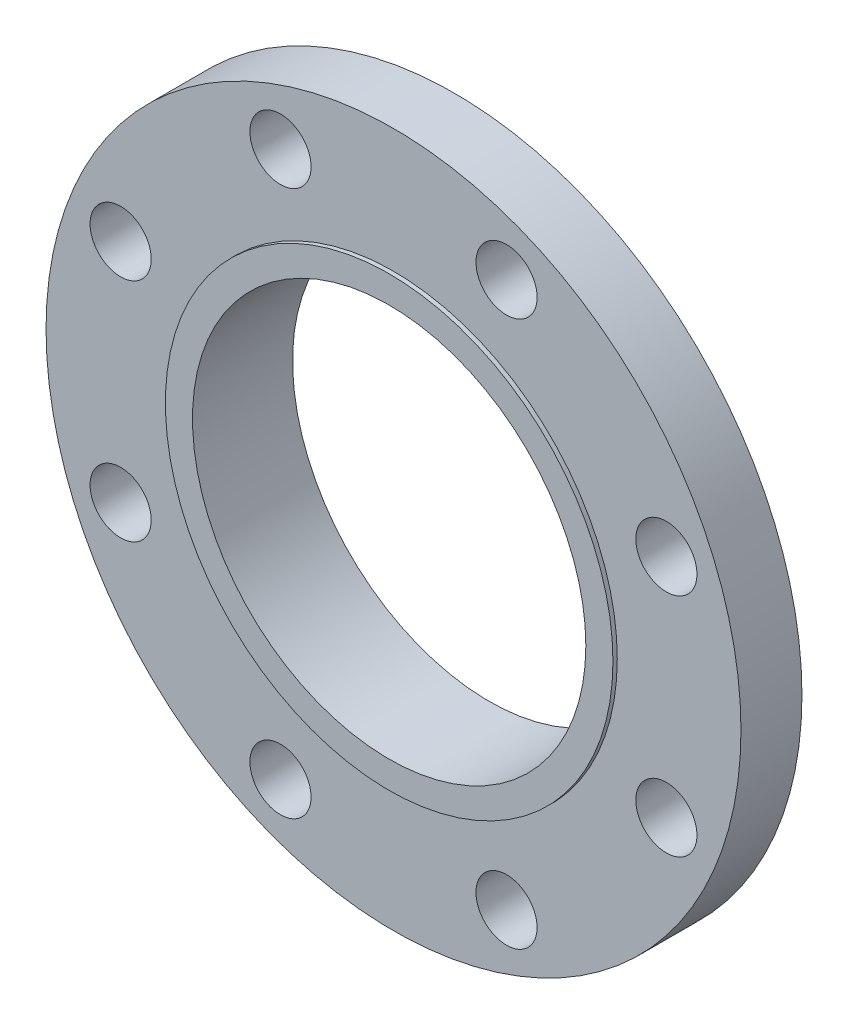
ISO-10303-21;
HEADER;
FILE_DESCRIPTION(('STEP AP214'),'2;1');
FILE_NAME('part.step','',(''),(''),'','','');
FILE_SCHEMA(('AUTOMOTIVE_DESIGN { 1 0 10303 214 1 1 1 1 }'));
ENDSEC;
DATA;
#1=APPLICATION_CONTEXT('core data for automotive mechanical design processes');
#2=APPLICATION_PROTOCOL_DEFINITION('international standard','automotive_design',2000,#1);
#3=PRODUCT_CONTEXT('',#1,'mechanical');
#4=PRODUCT('Part','Part','',(#3));
#5=PRODUCT_RELATED_PRODUCT_CATEGORY('part','',(#4));
#6=PRODUCT_DEFINITION_FORMATION('','',#4);
#7=PRODUCT_DEFINITION_CONTEXT('part definition',#1,'design');
#8=PRODUCT_DEFINITION('design','',#6,#7);
#9=PRODUCT_DEFINITION_SHAPE('','',#8);
#10=(LENGTH_UNIT() NAMED_UNIT(*) SI_UNIT(.MILLI.,.METRE.));
#11=(NAMED_UNIT(*) PLANE_ANGLE_UNIT() SI_UNIT($,.RADIAN.));
#12=(NAMED_UNIT(*) SI_UNIT($,.STERADIAN.) SOLID_ANGLE_UNIT());
#13=UNCERTAINTY_MEASURE_WITH_UNIT(LENGTH_MEASURE(1.E-05),#10,'distance_accuracy_value','');
#14=(GEOMETRIC_REPRESENTATION_CONTEXT(3) GLOBAL_UNCERTAINTY_ASSIGNED_CONTEXT((#13)) GLOBAL_UNIT_ASSIGNED_CONTEXT((#10,
#11,#12)) REPRESENTATION_CONTEXT('',''));
#15=CARTESIAN_POINT('',(0.,0.,0.));
#16=DIRECTION('',(0.,0.,1.));
#17=DIRECTION('',(1.,0.,0.));
#18=AXIS2_PLACEMENT_3D('',#15,#16,#17);
#19=CARTESIAN_POINT('',(0.,0.,-36.576));
#20=DIRECTION('',(0.,0.,1.));
#21=DIRECTION('',(1.,0.,0.));
#22=AXIS2_PLACEMENT_3D('',#19,#20,#21);
#23=CYLINDRICAL_SURFACE('',#22,81.788);
#24=CARTESIAN_POINT('',(0.,0.,-1.5875));
#25=DIRECTION('',(0.,0.,1.));
#26=DIRECTION('',(1.,0.,0.));
#27=AXIS2_PLACEMENT_3D('',#24,#25,#26);
#28=CIRCLE('',#27,81.788);
#29=CARTESIAN_POINT('',(81.788,0.,-1.5875));
#30=VERTEX_POINT('',#29);
#31=EDGE_CURVE('E10',#30,#30,#28,.F.);
#32=ORIENTED_EDGE('',*,*,#31,.F.);
#33=EDGE_LOOP('',(#32));
#34=FACE_BOUND('',#33,.T.);
#35=CARTESIAN_POINT('',(0.,0.,0.));
#36=DIRECTION('',(0.,0.,1.));
#37=DIRECTION('',(1.,0.,0.));
#38=AXIS2_PLACEMENT_3D('',#35,#36,#37);
#39=CIRCLE('',#38,81.788);
#40=CARTESIAN_POINT('',(81.788,0.,0.));
#41=VERTEX_POINT('',#40);
#42=EDGE_CURVE('E49',#41,#41,#39,.T.);
#43=ORIENTED_EDGE('',*,*,#42,.F.);
#44=EDGE_LOOP('',(#43));
#45=FACE_BOUND('',#44,.T.);
#46=ADVANCED_FACE('F37',(#34,#45),#23,.T.);
#47=CARTESIAN_POINT('',(0.,0.,0.));
#48=DIRECTION('',(0.,0.,1.));
#49=DIRECTION('',(1.,0.,0.));
#50=AXIS2_PLACEMENT_3D('',#47,#48,#49);
#51=PLANE('',#50);
#52=CARTESIAN_POINT('',(0.,0.,0.));
#53=DIRECTION('',(0.,0.,1.));
#54=DIRECTION('',(1.,0.,0.));
#55=AXIS2_PLACEMENT_3D('',#52,#53,#54);
#56=CIRCLE('',#55,71.882);
#57=CARTESIAN_POINT('',(71.882,0.,0.));
#58=VERTEX_POINT('',#57);
#59=EDGE_CURVE('E57',#58,#58,#56,.T.);
#60=ORIENTED_EDGE('',*,*,#59,.F.);
#61=EDGE_LOOP('',(#60));
#62=FACE_BOUND('',#61,.T.);
#63=ORIENTED_EDGE('',*,*,#42,.T.);
#64=EDGE_LOOP('',(#63));
#65=FACE_BOUND('',#64,.T.);
#66=ADVANCED_FACE('F93',(#62,#65),#51,.T.);
#67=CARTESIAN_POINT('',(0.,0.,-383.086244842766));
#68=DIRECTION('',(0.,0.,1.));
#69=DIRECTION('',(1.,0.,0.));
#70=AXIS2_PLACEMENT_3D('',#67,#68,#69);
#71=CYLINDRICAL_SURFACE('',#70,127.);
#72=CARTESIAN_POINT('',(0.,0.,-23.876));
#73=DIRECTION('',(0.,0.,1.));
#74=DIRECTION('',(1.,0.,0.));
#75=AXIS2_PLACEMENT_3D('',#72,#73,#74);
#76=CIRCLE('',#75,127.);
#77=CARTESIAN_POINT('',(127.,0.,-23.876));
#78=VERTEX_POINT('',#77);
#79=EDGE_CURVE('E61',#78,#78,#76,.F.);
#80=ORIENTED_EDGE('',*,*,#79,.F.);
#81=EDGE_LOOP('',(#80));
#82=FACE_BOUND('',#81,.T.);
#83=CARTESIAN_POINT('',(0.,0.,-1.5875));
#84=DIRECTION('',(0.,0.,1.));
#85=DIRECTION('',(1.,0.,0.));
#86=AXIS2_PLACEMENT_3D('',#83,#84,#85);
#87=CIRCLE('',#86,127.);
#88=CARTESIAN_POINT('',(127.,0.,-1.5875));
#89=VERTEX_POINT('',#88);
#90=EDGE_CURVE('E56',#89,#89,#87,.T.);
#91=ORIENTED_EDGE('',*,*,#90,.F.);
#92=EDGE_LOOP('',(#91));
#93=FACE_BOUND('',#92,.T.);
#94=ADVANCED_FACE('F90',(#82,#93),#71,.T.);
#95=CARTESIAN_POINT('',(0.,0.,-1.5875));
#96=DIRECTION('',(0.,0.,1.));
#97=DIRECTION('',(1.,0.,0.));
#98=AXIS2_PLACEMENT_3D('',#95,#96,#97);
#99=PLANE('',#98);
#100=CARTESIAN_POINT('',(99.7327955345929,41.3106765238126,-1.5875));
#101=DIRECTION('',(0.,0.,1.));
#102=DIRECTION('',(0.707106781186556,-0.707106781186539,0.));
#103=AXIS2_PLACEMENT_3D('',#100,#101,#102);
#104=CIRCLE('',#103,11.176);
#105=CARTESIAN_POINT('',(107.635420921134,33.4080511372718,-1.5875));
#106=VERTEX_POINT('',#105);
#107=EDGE_CURVE('E217',#106,#106,#104,.T.);
#108=ORIENTED_EDGE('',*,*,#107,.F.);
#109=EDGE_LOOP('',(#108));
#110=FACE_BOUND('',#109,.T.);
#111=CARTESIAN_POINT('',(99.7327955345938,-41.3106765238105,-1.5875));
#112=DIRECTION('',(0.,0.,1.));
#113=DIRECTION('',(0.,-1.,0.));
#114=AXIS2_PLACEMENT_3D('',#111,#112,#113);
#115=CIRCLE('',#114,11.176);
#116=CARTESIAN_POINT('',(99.7327955345939,-52.4866765238105,-1.5875));
#117=VERTEX_POINT('',#116);
#118=EDGE_CURVE('E221',#117,#117,#115,.T.);
#119=ORIENTED_EDGE('',*,*,#118,.F.);
#120=EDGE_LOOP('',(#119));
#121=FACE_BOUND('',#120,.T.);
#122=CARTESIAN_POINT('',(41.3106765238122,-99.7327955345931,-1.5875));
#123=DIRECTION('',(0.,0.,1.));
#124=DIRECTION('',(-0.707106781186541,-0.707106781186554,0.));
#125=AXIS2_PLACEMENT_3D('',#122,#123,#124);
#126=CIRCLE('',#125,11.176);
#127=CARTESIAN_POINT('',(33.4080511372714,-107.635420921134,-1.5875));
#128=VERTEX_POINT('',#127);
#129=EDGE_CURVE('E230',#128,#128,#126,.T.);
#130=ORIENTED_EDGE('',*,*,#129,.F.);
#131=EDGE_LOOP('',(#130));
#132=FACE_BOUND('',#131,.T.);
#133=CARTESIAN_POINT('',(-41.3106765238108,-99.7327955345937,-1.5875));
#134=DIRECTION('',(0.,0.,1.));
#135=DIRECTION('',(-1.,0.,0.));
#136=AXIS2_PLACEMENT_3D('',#133,#134,#135);
#137=CIRCLE('',#136,11.176);
#138=CARTESIAN_POINT('',(-52.4866765238108,-99.7327955345937,-1.5875));
#139=VERTEX_POINT('',#138);
#140=EDGE_CURVE('E236',#139,#139,#137,.T.);
#141=ORIENTED_EDGE('',*,*,#140,.F.);
#142=EDGE_LOOP('',(#141));
#143=FACE_BOUND('',#142,.T.);
#144=CARTESIAN_POINT('',(-99.7327955345932,-41.3106765238119,-1.5875));
#145=DIRECTION('',(0.,0.,1.));
#146=DIRECTION('',(-0.707106781186551,0.707106781186544,0.));
#147=AXIS2_PLACEMENT_3D('',#144,#145,#146);
#148=CIRCLE('',#147,11.176);
#149=CARTESIAN_POINT('',(-107.635420921134,-33.4080511372711,-1.5875));
#150=VERTEX_POINT('',#149);
#151=EDGE_CURVE('E242',#150,#150,#148,.T.);
#152=ORIENTED_EDGE('',*,*,#151,.F.);
#153=EDGE_LOOP('',(#152));
#154=FACE_BOUND('',#153,.T.);
#155=CARTESIAN_POINT('',(-99.7327955345935,41.3106765238112,-1.5875));
#156=DIRECTION('',(0.,0.,1.));
#157=DIRECTION('',(0.,1.,0.));
#158=AXIS2_PLACEMENT_3D('',#155,#156,#157);
#159=CIRCLE('',#158,11.176);
#160=CARTESIAN_POINT('',(-99.7327955345935,52.4866765238112,-1.5875));
#161=VERTEX_POINT('',#160);
#162=EDGE_CURVE('E248',#161,#161,#159,.T.);
#163=ORIENTED_EDGE('',*,*,#162,.F.);
#164=EDGE_LOOP('',(#163));
#165=FACE_BOUND('',#164,.T.);
#166=CARTESIAN_POINT('',(-41.3106765238115,99.7327955345934,-1.5875));
#167=DIRECTION('',(0.,0.,1.));
#168=DIRECTION('',(0.707106781186546,0.707106781186549,0.));
#169=AXIS2_PLACEMENT_3D('',#166,#167,#168);
#170=CIRCLE('',#169,11.176);
#171=CARTESIAN_POINT('',(-33.4080511372707,107.635420921134,-1.5875));
#172=VERTEX_POINT('',#171);
#173=EDGE_CURVE('E254',#172,#172,#170,.T.);
#174=ORIENTED_EDGE('',*,*,#173,.F.);
#175=EDGE_LOOP('',(#174));
#176=FACE_BOUND('',#175,.T.);
#177=CARTESIAN_POINT('',(41.3106765238115,99.7327955345934,-1.5875));
#178=DIRECTION('',(0.,0.,1.));
#179=DIRECTION('',(1.,0.,0.));
#180=AXIS2_PLACEMENT_3D('',#177,#178,#179);
#181=CIRCLE('',#180,11.176);
#182=CARTESIAN_POINT('',(52.4866765238115,99.7327955345934,-1.5875));
#183=VERTEX_POINT('',#182);
#184=EDGE_CURVE('E68',#183,#183,#181,.T.);
#185=ORIENTED_EDGE('',*,*,#184,.F.);
#186=EDGE_LOOP('',(#185));
#187=FACE_BOUND('',#186,.T.);
#188=ORIENTED_EDGE('',*,*,#31,.T.);
#189=EDGE_LOOP('',(#188));
#190=FACE_BOUND('',#189,.T.);
#191=ORIENTED_EDGE('',*,*,#90,.T.);
#192=EDGE_LOOP('',(#191));
#193=FACE_BOUND('',#192,.T.);
#194=ADVANCED_FACE('F85',(#110,#121,#132,#143,#154,#165,#176,#187,#190,#193),#99,.T.);
#195=CARTESIAN_POINT('',(0.,0.,-23.876));
#196=DIRECTION('',(0.,0.,1.));
#197=DIRECTION('',(1.,0.,0.));
#198=AXIS2_PLACEMENT_3D('',#195,#196,#197);
#199=PLANE('',#198);
#200=CARTESIAN_POINT('',(99.7327955345929,41.3106765238126,-23.876));
#201=DIRECTION('',(0.,0.,1.));
#202=DIRECTION('',(0.707106781186556,-0.707106781186539,0.));
#203=AXIS2_PLACEMENT_3D('',#200,#201,#202);
#204=CIRCLE('',#203,11.176);
#205=CARTESIAN_POINT('',(107.635420921134,33.4080511372718,-23.876));
#206=VERTEX_POINT('',#205);
#207=EDGE_CURVE('E220',#206,#206,#204,.T.);
#208=ORIENTED_EDGE('',*,*,#207,.T.);
#209=EDGE_LOOP('',(#208));
#210=FACE_BOUND('',#209,.T.);
#211=CARTESIAN_POINT('',(99.7327955345938,-41.3106765238105,-23.876));
#212=DIRECTION('',(0.,0.,1.));
#213=DIRECTION('',(0.,-1.,0.));
#214=AXIS2_PLACEMENT_3D('',#211,#212,#213);
#215=CIRCLE('',#214,11.176);
#216=CARTESIAN_POINT('',(99.7327955345939,-52.4866765238105,-23.876));
#217=VERTEX_POINT('',#216);
#218=EDGE_CURVE('E224',#217,#217,#215,.T.);
#219=ORIENTED_EDGE('',*,*,#218,.T.);
#220=EDGE_LOOP('',(#219));
#221=FACE_BOUND('',#220,.T.);
#222=CARTESIAN_POINT('',(41.3106765238122,-99.7327955345931,-23.876));
#223=DIRECTION('',(0.,0.,1.));
#224=DIRECTION('',(-0.707106781186541,-0.707106781186554,0.));
#225=AXIS2_PLACEMENT_3D('',#222,#223,#224);
#226=CIRCLE('',#225,11.176);
#227=CARTESIAN_POINT('',(33.4080511372714,-107.635420921134,-23.876));
#228=VERTEX_POINT('',#227);
#229=EDGE_CURVE('E233',#228,#228,#226,.T.);
#230=ORIENTED_EDGE('',*,*,#229,.T.);
#231=EDGE_LOOP('',(#230));
#232=FACE_BOUND('',#231,.T.);
#233=CARTESIAN_POINT('',(-41.3106765238108,-99.7327955345937,-23.876));
#234=DIRECTION('',(0.,0.,1.));
#235=DIRECTION('',(-1.,0.,0.));
#236=AXIS2_PLACEMENT_3D('',#233,#234,#235);
#237=CIRCLE('',#236,11.176);
#238=CARTESIAN_POINT('',(-52.4866765238108,-99.7327955345937,-23.876));
#239=VERTEX_POINT('',#238);
#240=EDGE_CURVE('E239',#239,#239,#237,.T.);
#241=ORIENTED_EDGE('',*,*,#240,.T.);
#242=EDGE_LOOP('',(#241));
#243=FACE_BOUND('',#242,.T.);
#244=CARTESIAN_POINT('',(-99.7327955345932,-41.3106765238119,-23.876));
#245=DIRECTION('',(0.,0.,1.));
#246=DIRECTION('',(-0.707106781186551,0.707106781186544,0.));
#247=AXIS2_PLACEMENT_3D('',#244,#245,#246);
#248=CIRCLE('',#247,11.176);
#249=CARTESIAN_POINT('',(-107.635420921134,-33.4080511372711,-23.876));
#250=VERTEX_POINT('',#249);
#251=EDGE_CURVE('E245',#250,#250,#248,.T.);
#252=ORIENTED_EDGE('',*,*,#251,.T.);
#253=EDGE_LOOP('',(#252));
#254=FACE_BOUND('',#253,.T.);
#255=CARTESIAN_POINT('',(-99.7327955345935,41.3106765238112,-23.876));
#256=DIRECTION('',(0.,0.,1.));
#257=DIRECTION('',(0.,1.,0.));
#258=AXIS2_PLACEMENT_3D('',#255,#256,#257);
#259=CIRCLE('',#258,11.176);
#260=CARTESIAN_POINT('',(-99.7327955345935,52.4866765238112,-23.876));
#261=VERTEX_POINT('',#260);
#262=EDGE_CURVE('E251',#261,#261,#259,.T.);
#263=ORIENTED_EDGE('',*,*,#262,.T.);
#264=EDGE_LOOP('',(#263));
#265=FACE_BOUND('',#264,.T.);
#266=CARTESIAN_POINT('',(-41.3106765238115,99.7327955345934,-23.876));
#267=DIRECTION('',(0.,0.,1.));
#268=DIRECTION('',(0.707106781186546,0.707106781186549,0.));
#269=AXIS2_PLACEMENT_3D('',#266,#267,#268);
#270=CIRCLE('',#269,11.176);
#271=CARTESIAN_POINT('',(-33.4080511372707,107.635420921134,-23.876));
#272=VERTEX_POINT('',#271);
#273=EDGE_CURVE('E256',#272,#272,#270,.T.);
#274=ORIENTED_EDGE('',*,*,#273,.T.);
#275=EDGE_LOOP('',(#274));
#276=FACE_BOUND('',#275,.T.);
#277=CARTESIAN_POINT('',(41.3106765238115,99.7327955345934,-23.876));
#278=DIRECTION('',(0.,0.,1.));
#279=DIRECTION('',(1.,0.,0.));
#280=AXIS2_PLACEMENT_3D('',#277,#278,#279);
#281=CIRCLE('',#280,11.176);
#282=CARTESIAN_POINT('',(52.4866765238115,99.7327955345934,-23.876));
#283=VERTEX_POINT('',#282);
#284=EDGE_CURVE('E40',#283,#283,#281,.T.);
#285=ORIENTED_EDGE('',*,*,#284,.T.);
#286=EDGE_LOOP('',(#285));
#287=FACE_BOUND('',#286,.T.);
#288=CARTESIAN_POINT('',(0.,0.,-23.876));
#289=DIRECTION('',(0.,0.,1.));
#290=DIRECTION('',(1.,0.,0.));
#291=AXIS2_PLACEMENT_3D('',#288,#289,#290);
#292=CIRCLE('',#291,81.788);
#293=CARTESIAN_POINT('',(81.788,0.,-23.876));
#294=VERTEX_POINT('',#293);
#295=EDGE_CURVE('E52',#294,#294,#292,.F.);
#296=ORIENTED_EDGE('',*,*,#295,.F.);
#297=EDGE_LOOP('',(#296));
#298=FACE_BOUND('',#297,.T.);
#299=ORIENTED_EDGE('',*,*,#79,.T.);
#300=EDGE_LOOP('',(#299));
#301=FACE_BOUND('',#300,.T.);
#302=ADVANCED_FACE('F81',(#210,#221,#232,#243,#254,#265,#276,#287,#298,#301),#199,.F.);
#303=CARTESIAN_POINT('',(0.,0.,-36.576));
#304=DIRECTION('',(0.,0.,1.));
#305=DIRECTION('',(1.,0.,0.));
#306=AXIS2_PLACEMENT_3D('',#303,#304,#305);
#307=PLANE('',#306);
#308=CARTESIAN_POINT('',(0.,0.,-36.576));
#309=DIRECTION('',(0.,0.,1.));
#310=DIRECTION('',(1.,0.,0.));
#311=AXIS2_PLACEMENT_3D('',#308,#309,#310);
#312=CIRCLE('',#311,71.882);
#313=CARTESIAN_POINT('',(71.882,0.,-36.576));
#314=VERTEX_POINT('',#313);
#315=EDGE_CURVE('E54',#314,#314,#312,.T.);
#316=ORIENTED_EDGE('',*,*,#315,.T.);
#317=EDGE_LOOP('',(#316));
#318=FACE_BOUND('',#317,.T.);
#319=CARTESIAN_POINT('',(0.,0.,-36.576));
#320=DIRECTION('',(0.,0.,1.));
#321=DIRECTION('',(1.,0.,0.));
#322=AXIS2_PLACEMENT_3D('',#319,#320,#321);
#323=CIRCLE('',#322,81.788);
#324=CARTESIAN_POINT('',(81.788,0.,-36.576));
#325=VERTEX_POINT('',#324);
#326=EDGE_CURVE('E44',#325,#325,#323,.T.);
#327=ORIENTED_EDGE('',*,*,#326,.F.);
#328=EDGE_LOOP('',(#327));
#329=FACE_BOUND('',#328,.T.);
#330=ADVANCED_FACE('F84',(#318,#329),#307,.F.);
#331=ORIENTED_EDGE('',*,*,#326,.T.);
#332=EDGE_LOOP('',(#331));
#333=FACE_BOUND('',#332,.T.);
#334=ORIENTED_EDGE('',*,*,#295,.T.);
#335=EDGE_LOOP('',(#334));
#336=FACE_BOUND('',#335,.T.);
#337=ADVANCED_FACE('F79',(#333,#336),#23,.T.);
#338=CARTESIAN_POINT('',(0.,0.,19.5213114803758));
#339=DIRECTION('',(0.,0.,1.));
#340=DIRECTION('',(1.,0.,0.));
#341=AXIS2_PLACEMENT_3D('',#338,#339,#340);
#342=CYLINDRICAL_SURFACE('',#341,71.882);
#343=ORIENTED_EDGE('',*,*,#59,.T.);
#344=EDGE_LOOP('',(#343));
#345=FACE_BOUND('',#344,.T.);
#346=ORIENTED_EDGE('',*,*,#315,.F.);
#347=EDGE_LOOP('',(#346));
#348=FACE_BOUND('',#347,.T.);
#349=ADVANCED_FACE('F113',(#345,#348),#342,.F.);
#350=CARTESIAN_POINT('',(41.3106765238115,99.7327955345934,-36.576));
#351=DIRECTION('',(0.,0.,1.));
#352=DIRECTION('',(1.,0.,0.));
#353=AXIS2_PLACEMENT_3D('',#350,#351,#352);
#354=CYLINDRICAL_SURFACE('',#353,11.176);
#355=ORIENTED_EDGE('',*,*,#184,.T.);
#356=EDGE_LOOP('',(#355));
#357=FACE_BOUND('',#356,.T.);
#358=ORIENTED_EDGE('',*,*,#284,.F.);
#359=EDGE_LOOP('',(#358));
#360=FACE_BOUND('',#359,.T.);
#361=ADVANCED_FACE('F118',(#357,#360),#354,.F.);
#362=CARTESIAN_POINT('',(-41.3106765238115,99.7327955345934,-36.576));
#363=DIRECTION('',(0.,0.,1.));
#364=DIRECTION('',(0.707106781186546,0.707106781186549,0.));
#365=AXIS2_PLACEMENT_3D('',#362,#363,#364);
#366=CYLINDRICAL_SURFACE('',#365,11.176);
#367=ORIENTED_EDGE('',*,*,#173,.T.);
#368=EDGE_LOOP('',(#367));
#369=FACE_BOUND('',#368,.T.);
#370=ORIENTED_EDGE('',*,*,#273,.F.);
#371=EDGE_LOOP('',(#370));
#372=FACE_BOUND('',#371,.T.);
#373=ADVANCED_FACE('F139',(#369,#372),#366,.F.);
#374=CARTESIAN_POINT('',(-99.7327955345935,41.3106765238112,-36.576));
#375=DIRECTION('',(0.,0.,1.));
#376=DIRECTION('',(0.,1.,0.));
#377=AXIS2_PLACEMENT_3D('',#374,#375,#376);
#378=CYLINDRICAL_SURFACE('',#377,11.176);
#379=ORIENTED_EDGE('',*,*,#162,.T.);
#380=EDGE_LOOP('',(#379));
#381=FACE_BOUND('',#380,.T.);
#382=ORIENTED_EDGE('',*,*,#262,.F.);
#383=EDGE_LOOP('',(#382));
#384=FACE_BOUND('',#383,.T.);
#385=ADVANCED_FACE('F152',(#381,#384),#378,.F.);
#386=CARTESIAN_POINT('',(-99.7327955345932,-41.3106765238119,-36.576));
#387=DIRECTION('',(0.,0.,1.));
#388=DIRECTION('',(-0.707106781186551,0.707106781186544,0.));
#389=AXIS2_PLACEMENT_3D('',#386,#387,#388);
#390=CYLINDRICAL_SURFACE('',#389,11.176);
#391=ORIENTED_EDGE('',*,*,#151,.T.);
#392=EDGE_LOOP('',(#391));
#393=FACE_BOUND('',#392,.T.);
#394=ORIENTED_EDGE('',*,*,#251,.F.);
#395=EDGE_LOOP('',(#394));
#396=FACE_BOUND('',#395,.T.);
#397=ADVANCED_FACE('F162',(#393,#396),#390,.F.);
#398=CARTESIAN_POINT('',(-41.3106765238108,-99.7327955345937,-36.576));
#399=DIRECTION('',(0.,0.,1.));
#400=DIRECTION('',(-1.,0.,0.));
#401=AXIS2_PLACEMENT_3D('',#398,#399,#400);
#402=CYLINDRICAL_SURFACE('',#401,11.176);
#403=ORIENTED_EDGE('',*,*,#140,.T.);
#404=EDGE_LOOP('',(#403));
#405=FACE_BOUND('',#404,.T.);
#406=ORIENTED_EDGE('',*,*,#240,.F.);
#407=EDGE_LOOP('',(#406));
#408=FACE_BOUND('',#407,.T.);
#409=ADVANCED_FACE('F172',(#405,#408),#402,.F.);
#410=CARTESIAN_POINT('',(41.3106765238122,-99.7327955345931,-36.576));
#411=DIRECTION('',(0.,0.,1.));
#412=DIRECTION('',(-0.707106781186541,-0.707106781186554,0.));
#413=AXIS2_PLACEMENT_3D('',#410,#411,#412);
#414=CYLINDRICAL_SURFACE('',#413,11.176);
#415=ORIENTED_EDGE('',*,*,#129,.T.);
#416=EDGE_LOOP('',(#415));
#417=FACE_BOUND('',#416,.T.);
#418=ORIENTED_EDGE('',*,*,#229,.F.);
#419=EDGE_LOOP('',(#418));
#420=FACE_BOUND('',#419,.T.);
#421=ADVANCED_FACE('F182',(#417,#420),#414,.F.);
#422=CARTESIAN_POINT('',(99.7327955345938,-41.3106765238105,-36.576));
#423=DIRECTION('',(0.,0.,1.));
#424=DIRECTION('',(0.,-1.,0.));
#425=AXIS2_PLACEMENT_3D('',#422,#423,#424);
#426=CYLINDRICAL_SURFACE('',#425,11.176);
#427=ORIENTED_EDGE('',*,*,#118,.T.);
#428=EDGE_LOOP('',(#427));
#429=FACE_BOUND('',#428,.T.);
#430=ORIENTED_EDGE('',*,*,#218,.F.);
#431=EDGE_LOOP('',(#430));
#432=FACE_BOUND('',#431,.T.);
#433=ADVANCED_FACE('F192',(#429,#432),#426,.F.);
#434=CARTESIAN_POINT('',(99.7327955345929,41.3106765238126,-36.576));
#435=DIRECTION('',(0.,0.,1.));
#436=DIRECTION('',(0.707106781186556,-0.707106781186539,0.));
#437=AXIS2_PLACEMENT_3D('',#434,#435,#436);
#438=CYLINDRICAL_SURFACE('',#437,11.176);
#439=ORIENTED_EDGE('',*,*,#107,.T.);
#440=EDGE_LOOP('',(#439));
#441=FACE_BOUND('',#440,.T.);
#442=ORIENTED_EDGE('',*,*,#207,.F.);
#443=EDGE_LOOP('',(#442));
#444=FACE_BOUND('',#443,.T.);
#445=ADVANCED_FACE('F202',(#441,#444),#438,.F.);
#446=CLOSED_SHELL('',(#46,#66,#94,#194,#302,#330,#337,#349,#361,#373,#385,#397,#409,#421,#433,#445));
#447=MANIFOLD_SOLID_BREP('B2',#446);
#448=ADVANCED_BREP_SHAPE_REPRESENTATION('',(#18,#447),#14);
#449=SHAPE_DEFINITION_REPRESENTATION(#9,#448);
ENDSEC;
END-ISO-10303-21;
